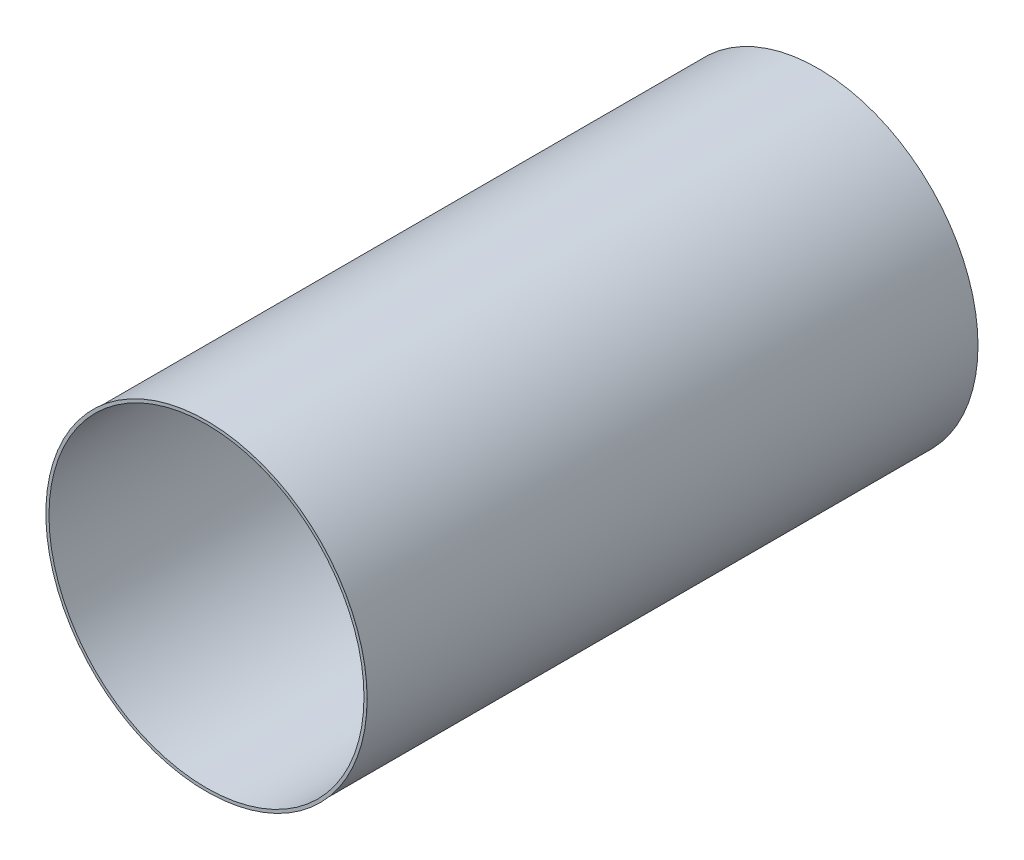
ISO-10303-21;
HEADER;
FILE_DESCRIPTION(('STEP AP214'),'2;1');
FILE_NAME('part.step','',(''),(''),'','','');
FILE_SCHEMA(('AUTOMOTIVE_DESIGN { 1 0 10303 214 1 1 1 1 }'));
ENDSEC;
DATA;
#1=APPLICATION_CONTEXT('core data for automotive mechanical design processes');
#2=APPLICATION_PROTOCOL_DEFINITION('international standard','automotive_design',2000,#1);
#3=PRODUCT_CONTEXT('',#1,'mechanical');
#4=PRODUCT('Part','Part','',(#3));
#5=PRODUCT_RELATED_PRODUCT_CATEGORY('part','',(#4));
#6=PRODUCT_DEFINITION_FORMATION('','',#4);
#7=PRODUCT_DEFINITION_CONTEXT('part definition',#1,'design');
#8=PRODUCT_DEFINITION('design','',#6,#7);
#9=PRODUCT_DEFINITION_SHAPE('','',#8);
#10=(LENGTH_UNIT() NAMED_UNIT(*) SI_UNIT(.MILLI.,.METRE.));
#11=(NAMED_UNIT(*) PLANE_ANGLE_UNIT() SI_UNIT($,.RADIAN.));
#12=(NAMED_UNIT(*) SI_UNIT($,.STERADIAN.) SOLID_ANGLE_UNIT());
#13=UNCERTAINTY_MEASURE_WITH_UNIT(LENGTH_MEASURE(1.E-05),#10,'distance_accuracy_value','');
#14=(GEOMETRIC_REPRESENTATION_CONTEXT(3) GLOBAL_UNCERTAINTY_ASSIGNED_CONTEXT((#13)) GLOBAL_UNIT_ASSIGNED_CONTEXT((#10,
#11,#12)) REPRESENTATION_CONTEXT('',''));
#15=CARTESIAN_POINT('',(0.,0.,0.));
#16=DIRECTION('',(0.,0.,1.));
#17=DIRECTION('',(1.,0.,0.));
#18=AXIS2_PLACEMENT_3D('',#15,#16,#17);
#19=CARTESIAN_POINT('',(-78.36,1.5875,-914.4));
#20=DIRECTION('',(0.,0.,1.));
#21=DIRECTION('',(1.,0.,0.));
#22=AXIS2_PLACEMENT_3D('',#19,#20,#21);
#23=CYLINDRICAL_SURFACE('',#22,77.09);
#24=CARTESIAN_POINT('',(-78.36,1.5875,-299.260099631724));
#25=DIRECTION('',(0.,0.,1.));
#26=DIRECTION('',(1.,0.,0.));
#27=AXIS2_PLACEMENT_3D('',#24,#25,#26);
#28=CIRCLE('',#27,77.09);
#29=CARTESIAN_POINT('',(-1.26999999999999,1.5875,-299.260099631724));
#30=VERTEX_POINT('',#29);
#31=EDGE_CURVE('E56',#30,#30,#28,.F.);
#32=CARTESIAN_POINT('',(-78.36,1.5875,0.));
#33=DIRECTION('',(0.,0.,1.));
#34=DIRECTION('',(1.,0.,0.));
#35=AXIS2_PLACEMENT_3D('',#32,#33,#34);
#36=CIRCLE('',#35,77.09);
#37=CARTESIAN_POINT('',(-1.26999999999999,1.5875,-1.11022302462516E-13));
#38=VERTEX_POINT('',#37);
#39=EDGE_CURVE('E10',#38,#38,#36,.T.);
#40=CARTESIAN_POINT('',(-1.26999999999999,1.5875,-299.260099631724));
#41=CARTESIAN_POINT('',(-1.26999999999999,1.5875,-296.142806927226));
#42=CARTESIAN_POINT('',(-1.26999999999999,1.5875,-293.025514222729));
#43=CARTESIAN_POINT('',(-1.26999999999999,1.5875,-286.790928813735));
#44=CARTESIAN_POINT('',(-1.26999999999999,1.5875,-283.673636109238));
#45=CARTESIAN_POINT('',(-1.26999999999999,1.5875,-277.439050700244));
#46=CARTESIAN_POINT('',(-1.26999999999999,1.5875,-274.321757995747));
#47=CARTESIAN_POINT('',(-1.26999999999999,1.5875,-268.087172586752));
#48=CARTESIAN_POINT('',(-1.26999999999999,1.5875,-264.969879882255));
#49=CARTESIAN_POINT('',(-1.26999999999999,1.5875,-258.735294473261));
#50=CARTESIAN_POINT('',(-1.26999999999999,1.5875,-255.618001768764));
#51=CARTESIAN_POINT('',(-1.26999999999999,1.5875,-249.38341635977));
#52=CARTESIAN_POINT('',(-1.26999999999999,1.5875,-246.266123655272));
#53=CARTESIAN_POINT('',(-1.26999999999999,1.5875,-240.031538246278));
#54=CARTESIAN_POINT('',(-1.26999999999999,1.5875,-236.914245541781));
#55=CARTESIAN_POINT('',(-1.26999999999999,1.5875,-230.679660132787));
#56=CARTESIAN_POINT('',(-1.26999999999999,1.5875,-227.56236742829));
#57=CARTESIAN_POINT('',(-1.26999999999999,1.5875,-221.327782019295));
#58=CARTESIAN_POINT('',(-1.26999999999999,1.5875,-218.210489314798));
#59=CARTESIAN_POINT('',(-1.26999999999999,1.5875,-211.975903905804));
#60=CARTESIAN_POINT('',(-1.26999999999999,1.5875,-208.858611201307));
#61=CARTESIAN_POINT('',(-1.26999999999999,1.5875,-202.624025792313));
#62=CARTESIAN_POINT('',(-1.26999999999999,1.5875,-199.506733087816));
#63=CARTESIAN_POINT('',(-1.26999999999999,1.5875,-193.272147678822));
#64=CARTESIAN_POINT('',(-1.26999999999999,1.5875,-190.154854974324));
#65=CARTESIAN_POINT('',(-1.26999999999999,1.5875,-183.92026956533));
#66=CARTESIAN_POINT('',(-1.26999999999999,1.5875,-180.802976860833));
#67=CARTESIAN_POINT('',(-1.26999999999999,1.5875,-174.568391451839));
#68=CARTESIAN_POINT('',(-1.26999999999999,1.5875,-171.451098747342));
#69=CARTESIAN_POINT('',(-1.26999999999999,1.5875,-165.216513338347));
#70=CARTESIAN_POINT('',(-1.26999999999999,1.5875,-162.09922063385));
#71=CARTESIAN_POINT('',(-1.26999999999999,1.5875,-155.864635224856));
#72=CARTESIAN_POINT('',(-1.26999999999999,1.5875,-152.747342520359));
#73=CARTESIAN_POINT('',(-1.26999999999999,1.5875,-146.512757111365));
#74=CARTESIAN_POINT('',(-1.26999999999999,1.5875,-143.395464406868));
#75=CARTESIAN_POINT('',(-1.26999999999999,1.5875,-137.160878997873));
#76=CARTESIAN_POINT('',(-1.26999999999999,1.5875,-134.043586293376));
#77=CARTESIAN_POINT('',(-1.26999999999999,1.5875,-127.809000884382));
#78=CARTESIAN_POINT('',(-1.26999999999999,1.5875,-124.691708179885));
#79=CARTESIAN_POINT('',(-1.26999999999999,1.5875,-118.457122770891));
#80=CARTESIAN_POINT('',(-1.26999999999999,1.5875,-115.339830066393));
#81=CARTESIAN_POINT('',(-1.26999999999999,1.5875,-109.105244657399));
#82=CARTESIAN_POINT('',(-1.26999999999999,1.5875,-105.987951952902));
#83=CARTESIAN_POINT('',(-1.26999999999999,1.5875,-99.7533665439079));
#84=CARTESIAN_POINT('',(-1.26999999999999,1.5875,-96.6360738394108));
#85=CARTESIAN_POINT('',(-1.26999999999999,1.5875,-90.4014884304166));
#86=CARTESIAN_POINT('',(-1.26999999999999,1.5875,-87.2841957259195));
#87=CARTESIAN_POINT('',(-1.26999999999999,1.5875,-81.0496103169253));
#88=CARTESIAN_POINT('',(-1.26999999999999,1.5875,-77.9323176124281));
#89=CARTESIAN_POINT('',(-1.26999999999999,1.5875,-71.6977322034339));
#90=CARTESIAN_POINT('',(-1.26999999999999,1.5875,-68.5804394989368));
#91=CARTESIAN_POINT('',(-1.26999999999999,1.5875,-62.3458540899425));
#92=CARTESIAN_POINT('',(-1.26999999999999,1.5875,-59.2285613854454));
#93=CARTESIAN_POINT('',(-1.26999999999999,1.5875,-52.9939759764512));
#94=CARTESIAN_POINT('',(-1.26999999999999,1.5875,-49.8766832719541));
#95=CARTESIAN_POINT('',(-1.26999999999999,1.5875,-43.6420978629598));
#96=CARTESIAN_POINT('',(-1.26999999999999,1.5875,-40.5248051584627));
#97=CARTESIAN_POINT('',(-1.26999999999999,1.5875,-34.2902197494684));
#98=CARTESIAN_POINT('',(-1.26999999999999,1.5875,-31.1729270449713));
#99=CARTESIAN_POINT('',(-1.26999999999999,1.5875,-24.9383416359771));
#100=CARTESIAN_POINT('',(-1.26999999999999,1.5875,-21.82104893148));
#101=CARTESIAN_POINT('',(-1.26999999999999,1.5875,-15.5864635224857));
#102=CARTESIAN_POINT('',(-1.26999999999999,1.5875,-12.4691708179886));
#103=CARTESIAN_POINT('',(-1.26999999999999,1.5875,-6.23458540899435));
#104=CARTESIAN_POINT('',(-1.26999999999999,1.5875,-3.11729270449723));
#105=CARTESIAN_POINT('',(-1.26999999999999,1.5875,-1.11022302462516E-13));
#106=B_SPLINE_CURVE_WITH_KNOTS('',3,(#40,#41,#42,#43,#44,#45,#46,#47,#48,#49,#50,#51,#52,#53,
#54,#55,#56,#57,#58,#59,#60,#61,#62,#63,#64,#65,#66,#67,#68,#69,#70,#71,#72,#73,#74,#75,#76,#77,
#78,#79,#80,#81,#82,#83,#84,#85,#86,#87,#88,#89,#90,#91,#92,#93,#94,#95,#96,#97,#98,#99,#100,
#101,#102,#103,#104,#105),.UNSPECIFIED.,.F.,.F.,(4,2,2,2,2,2,2,2,2,2,2,2,2,2,2,2,2,2,2,2,2,2,2,
2,2,2,2,2,2,2,2,2,4),(0.,9.35187811349136,18.7037562269827,28.0556343404741,37.4075124539655,
46.7593905674568,56.1112686809482,65.4631467944395,74.8150249079309,84.1669030214223,
93.5187811349135,102.870659248405,112.222537361896,121.574415475388,130.926293588879,
140.27817170237,149.630049815862,158.981927929353,168.333806042844,177.685684156336,
187.037562269827,196.389440383319,205.74131849681,215.093196610301,224.445074723792,
233.796952837284,243.148830950775,252.500709064267,261.852587177758,271.204465291249,
280.556343404741,289.908221518232,299.260099631723),.UNSPECIFIED.);
#107=EDGE_CURVE('BSEAM37',#30,#38,#106,.T.);
#108=ORIENTED_EDGE('',*,*,#31,.T.);
#109=ORIENTED_EDGE('',*,*,#39,.T.);
#110=ORIENTED_EDGE('',*,*,#107,.T.);
#111=ORIENTED_EDGE('',*,*,#107,.F.);
#112=EDGE_LOOP('',(#108,#110,#109,#111));
#113=FACE_BOUND('',#112,.T.);
#114=ADVANCED_FACE('F37',(#113),#23,.F.);
#115=CARTESIAN_POINT('',(-78.36,1.5875,-914.4));
#116=DIRECTION('',(0.,0.,1.));
#117=DIRECTION('',(1.,0.,0.));
#118=AXIS2_PLACEMENT_3D('',#115,#116,#117);
#119=CYLINDRICAL_SURFACE('',#118,78.36);
#120=CARTESIAN_POINT('',(-78.36,1.5875,-0.099999999999989));
#121=DIRECTION('',(0.,0.,1.));
#122=DIRECTION('',(1.,0.,0.));
#123=AXIS2_PLACEMENT_3D('',#120,#121,#122);
#124=CIRCLE('',#123,78.36);
#125=CARTESIAN_POINT('',(0.,1.5875,-0.1000000000001));
#126=VERTEX_POINT('',#125);
#127=EDGE_CURVE('E44',#126,#126,#124,.F.);
#128=CARTESIAN_POINT('',(-78.36,1.5875,-299.260099631724));
#129=DIRECTION('',(0.,0.,1.));
#130=DIRECTION('',(1.,0.,0.));
#131=AXIS2_PLACEMENT_3D('',#128,#129,#130);
#132=CIRCLE('',#131,78.36);
#133=CARTESIAN_POINT('',(0.,1.5875,-299.260099631724));
#134=VERTEX_POINT('',#133);
#135=EDGE_CURVE('E60',#134,#134,#132,.F.);
#136=CARTESIAN_POINT('',(0.,1.5875,-0.1000000000001));
#137=CARTESIAN_POINT('',(0.,1.5875,-3.21625103783056));
#138=CARTESIAN_POINT('',(0.,1.5875,-6.33250207566101));
#139=CARTESIAN_POINT('',(0.,1.5875,-12.5650041513219));
#140=CARTESIAN_POINT('',(0.,1.5875,-15.6812551891524));
#141=CARTESIAN_POINT('',(0.,1.5875,-21.9137572648133));
#142=CARTESIAN_POINT('',(0.,1.5875,-25.0300083026438));
#143=CARTESIAN_POINT('',(0.,1.5875,-31.2625103783047));
#144=CARTESIAN_POINT('',(0.,1.5875,-34.3787614161351));
#145=CARTESIAN_POINT('',(0.,1.5875,-40.611263491796));
#146=CARTESIAN_POINT('',(0.,1.5875,-43.7275145296264));
#147=CARTESIAN_POINT('',(0.,1.5875,-49.9600166052873));
#148=CARTESIAN_POINT('',(0.,1.5875,-53.0762676431178));
#149=CARTESIAN_POINT('',(0.,1.5875,-59.3087697187787));
#150=CARTESIAN_POINT('',(0.,1.5875,-62.4250207566091));
#151=CARTESIAN_POINT('',(0.,1.5875,-68.65752283227));
#152=CARTESIAN_POINT('',(0.,1.5875,-71.7737738701005));
#153=CARTESIAN_POINT('',(0.,1.5875,-78.0062759457614));
#154=CARTESIAN_POINT('',(0.,1.5875,-81.1225269835919));
#155=CARTESIAN_POINT('',(0.,1.5875,-87.3550290592528));
#156=CARTESIAN_POINT('',(0.,1.5875,-90.4712800970832));
#157=CARTESIAN_POINT('',(0.,1.5875,-96.7037821727442));
#158=CARTESIAN_POINT('',(0.,1.5875,-99.8200332105746));
#159=CARTESIAN_POINT('',(0.,1.5875,-106.052535286235));
#160=CARTESIAN_POINT('',(0.,1.5875,-109.168786324066));
#161=CARTESIAN_POINT('',(0.,1.5875,-115.401288399727));
#162=CARTESIAN_POINT('',(0.,1.5875,-118.517539437557));
#163=CARTESIAN_POINT('',(0.,1.5875,-124.750041513218));
#164=CARTESIAN_POINT('',(0.,1.5875,-127.866292551049));
#165=CARTESIAN_POINT('',(0.,1.5875,-134.09879462671));
#166=CARTESIAN_POINT('',(0.,1.5875,-137.21504566454));
#167=CARTESIAN_POINT('',(0.,1.5875,-143.447547740201));
#168=CARTESIAN_POINT('',(0.,1.5875,-146.563798778031));
#169=CARTESIAN_POINT('',(0.,1.5875,-152.796300853692));
#170=CARTESIAN_POINT('',(0.,1.5875,-155.912551891523));
#171=CARTESIAN_POINT('',(0.,1.5875,-162.145053967184));
#172=CARTESIAN_POINT('',(0.,1.5875,-165.261305005014));
#173=CARTESIAN_POINT('',(0.,1.5875,-171.493807080675));
#174=CARTESIAN_POINT('',(0.,1.5875,-174.610058118505));
#175=CARTESIAN_POINT('',(0.,1.5875,-180.842560194166));
#176=CARTESIAN_POINT('',(0.,1.5875,-183.958811231997));
#177=CARTESIAN_POINT('',(0.,1.5875,-190.191313307658));
#178=CARTESIAN_POINT('',(0.,1.5875,-193.307564345488));
#179=CARTESIAN_POINT('',(0.,1.5875,-199.540066421149));
#180=CARTESIAN_POINT('',(0.,1.5875,-202.656317458979));
#181=CARTESIAN_POINT('',(0.,1.5875,-208.88881953464));
#182=CARTESIAN_POINT('',(0.,1.5875,-212.005070572471));
#183=CARTESIAN_POINT('',(0.,1.5875,-218.237572648132));
#184=CARTESIAN_POINT('',(0.,1.5875,-221.353823685962));
#185=CARTESIAN_POINT('',(0.,1.5875,-227.586325761623));
#186=CARTESIAN_POINT('',(0.,1.5875,-230.702576799454));
#187=CARTESIAN_POINT('',(0.,1.5875,-236.935078875114));
#188=CARTESIAN_POINT('',(0.,1.5875,-240.051329912945));
#189=CARTESIAN_POINT('',(0.,1.5875,-246.283831988606));
#190=CARTESIAN_POINT('',(0.,1.5875,-249.400083026436));
#191=CARTESIAN_POINT('',(0.,1.5875,-255.632585102097));
#192=CARTESIAN_POINT('',(0.,1.5875,-258.748836139928));
#193=CARTESIAN_POINT('',(0.,1.5875,-264.981338215588));
#194=CARTESIAN_POINT('',(0.,1.5875,-268.097589253419));
#195=CARTESIAN_POINT('',(0.,1.5875,-274.33009132908));
#196=CARTESIAN_POINT('',(0.,1.5875,-277.44634236691));
#197=CARTESIAN_POINT('',(0.,1.5875,-283.678844442571));
#198=CARTESIAN_POINT('',(0.,1.5875,-286.795095480402));
#199=CARTESIAN_POINT('',(0.,1.5875,-293.027597556063));
#200=CARTESIAN_POINT('',(0.,1.5875,-296.143848593893));
#201=CARTESIAN_POINT('',(0.,1.5875,-299.260099631724));
#202=B_SPLINE_CURVE_WITH_KNOTS('',3,(#136,#137,#138,#139,#140,#141,#142,#143,#144,#145,#146,
#147,#148,#149,#150,#151,#152,#153,#154,#155,#156,#157,#158,#159,#160,#161,#162,#163,#164,#165,
#166,#167,#168,#169,#170,#171,#172,#173,#174,#175,#176,#177,#178,#179,#180,#181,#182,#183,#184,
#185,#186,#187,#188,#189,#190,#191,#192,#193,#194,#195,#196,#197,#198,#199,#200,#201),
.UNSPECIFIED.,.F.,.F.,(4,2,2,2,2,2,2,2,2,2,2,2,2,2,2,2,2,2,2,2,2,2,2,2,2,2,2,2,2,2,2,2,4),(0.,
9.34875311349137,18.6975062269827,28.0462593404741,37.3950124539655,46.7437655674567,
56.0925186809481,65.4412717944395,74.7900249079309,84.1387780214222,93.4875311349136,
102.836284248405,112.185037361896,121.533790475388,130.882543588879,140.23129670237,
149.580049815862,158.928802929353,168.277556042844,177.626309156336,186.975062269827,
196.323815383318,205.67256849681,215.021321610301,224.370074723793,233.718827837284,
243.067580950775,252.416334064267,261.765087177758,271.113840291249,280.462593404741,
289.811346518232,299.160099631723),.UNSPECIFIED.);
#203=EDGE_CURVE('BSEAM39',#126,#134,#202,.T.);
#204=ORIENTED_EDGE('',*,*,#127,.T.);
#205=ORIENTED_EDGE('',*,*,#135,.F.);
#206=ORIENTED_EDGE('',*,*,#203,.T.);
#207=ORIENTED_EDGE('',*,*,#203,.F.);
#208=EDGE_LOOP('',(#204,#206,#205,#207));
#209=FACE_BOUND('',#208,.T.);
#210=ADVANCED_FACE('F39',(#209),#119,.T.);
#211=CARTESIAN_POINT('',(-78.36,1.5875,0.));
#212=DIRECTION('',(0.,0.,1.));
#213=DIRECTION('',(1.,0.,0.));
#214=AXIS2_PLACEMENT_3D('',#211,#212,#213);
#215=PLANE('',#214);
#216=ORIENTED_EDGE('',*,*,#39,.F.);
#217=EDGE_LOOP('',(#216));
#218=FACE_BOUND('',#217,.T.);
#219=CARTESIAN_POINT('',(-78.36,1.5875,0.));
#220=DIRECTION('',(0.,0.,1.));
#221=DIRECTION('',(1.,0.,0.));
#222=AXIS2_PLACEMENT_3D('',#219,#220,#221);
#223=CIRCLE('',#222,78.614);
#224=CARTESIAN_POINT('',(0.254000000000004,1.5875,0.));
#225=VERTEX_POINT('',#224);
#226=EDGE_CURVE('E52',#225,#225,#223,.T.);
#227=ORIENTED_EDGE('',*,*,#226,.T.);
#228=EDGE_LOOP('',(#227));
#229=FACE_BOUND('',#228,.T.);
#230=ADVANCED_FACE('F68',(#218,#229),#215,.T.);
#231=CARTESIAN_POINT('',(-78.36,1.5875,-0.1));
#232=DIRECTION('',(0.,0.,1.));
#233=DIRECTION('',(1.,0.,0.));
#234=AXIS2_PLACEMENT_3D('',#231,#232,#233);
#235=CYLINDRICAL_SURFACE('',#234,78.614);
#236=CARTESIAN_POINT('',(-78.36,1.5875,-0.1));
#237=DIRECTION('',(0.,0.,1.));
#238=DIRECTION('',(1.,0.,0.));
#239=AXIS2_PLACEMENT_3D('',#236,#237,#238);
#240=CIRCLE('',#239,78.614);
#241=CARTESIAN_POINT('',(0.254000000000004,1.5875,-0.1));
#242=VERTEX_POINT('',#241);
#243=EDGE_CURVE('E48',#242,#242,#240,.T.);
#244=ORIENTED_EDGE('',*,*,#243,.T.);
#245=EDGE_LOOP('',(#244));
#246=FACE_BOUND('',#245,.T.);
#247=ORIENTED_EDGE('',*,*,#226,.F.);
#248=EDGE_LOOP('',(#247));
#249=FACE_BOUND('',#248,.T.);
#250=ADVANCED_FACE('F73',(#246,#249),#235,.T.);
#251=CARTESIAN_POINT('',(0.,0.,-0.1));
#252=DIRECTION('',(0.,0.,1.));
#253=DIRECTION('',(1.,0.,0.));
#254=AXIS2_PLACEMENT_3D('',#251,#252,#253);
#255=PLANE('',#254);
#256=ORIENTED_EDGE('',*,*,#127,.F.);
#257=EDGE_LOOP('',(#256));
#258=FACE_BOUND('',#257,.T.);
#259=ORIENTED_EDGE('',*,*,#243,.F.);
#260=EDGE_LOOP('',(#259));
#261=FACE_BOUND('',#260,.T.);
#262=ADVANCED_FACE('F84',(#258,#261),#255,.F.);
#263=CARTESIAN_POINT('',(-78.36,1.5875,-299.260099631724));
#264=DIRECTION('',(0.,0.,1.));
#265=DIRECTION('',(1.,0.,0.));
#266=AXIS2_PLACEMENT_3D('',#263,#264,#265);
#267=PLANE('',#266);
#268=ORIENTED_EDGE('',*,*,#135,.T.);
#269=EDGE_LOOP('',(#268));
#270=FACE_BOUND('',#269,.T.);
#271=ORIENTED_EDGE('',*,*,#31,.F.);
#272=EDGE_LOOP('',(#271));
#273=FACE_BOUND('',#272,.T.);
#274=ADVANCED_FACE('F64',(#270,#273),#267,.F.);
#275=CLOSED_SHELL('',(#114,#210,#230,#250,#262,#274));
#276=MANIFOLD_SOLID_BREP('B2',#275);
#277=ADVANCED_BREP_SHAPE_REPRESENTATION('',(#18,#276),#14);
#278=SHAPE_DEFINITION_REPRESENTATION(#9,#277);
ENDSEC;
END-ISO-10303-21;
